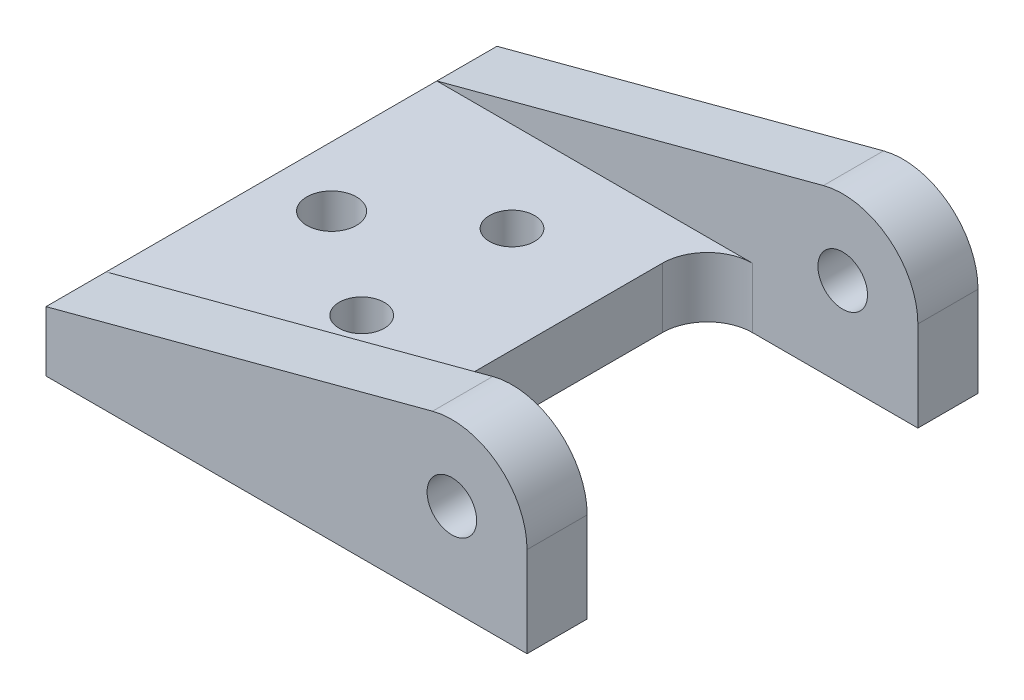
ISO-10303-21;
HEADER;
FILE_DESCRIPTION(('STEP AP214'),'2;1');
FILE_NAME('part.step','',(''),(''),'','','');
FILE_SCHEMA(('AUTOMOTIVE_DESIGN { 1 0 10303 214 1 1 1 1 }'));
ENDSEC;
DATA;
#1=APPLICATION_CONTEXT('core data for automotive mechanical design processes');
#2=APPLICATION_PROTOCOL_DEFINITION('international standard','automotive_design',2000,#1);
#3=PRODUCT_CONTEXT('',#1,'mechanical');
#4=PRODUCT('Part','Part','',(#3));
#5=PRODUCT_RELATED_PRODUCT_CATEGORY('part','',(#4));
#6=PRODUCT_DEFINITION_FORMATION('','',#4);
#7=PRODUCT_DEFINITION_CONTEXT('part definition',#1,'design');
#8=PRODUCT_DEFINITION('design','',#6,#7);
#9=PRODUCT_DEFINITION_SHAPE('','',#8);
#10=(LENGTH_UNIT() NAMED_UNIT(*) SI_UNIT(.MILLI.,.METRE.));
#11=(NAMED_UNIT(*) PLANE_ANGLE_UNIT() SI_UNIT($,.RADIAN.));
#12=(NAMED_UNIT(*) SI_UNIT($,.STERADIAN.) SOLID_ANGLE_UNIT());
#13=UNCERTAINTY_MEASURE_WITH_UNIT(LENGTH_MEASURE(1.E-05),#10,'distance_accuracy_value','');
#14=(GEOMETRIC_REPRESENTATION_CONTEXT(3) GLOBAL_UNCERTAINTY_ASSIGNED_CONTEXT((#13)) GLOBAL_UNIT_ASSIGNED_CONTEXT((#10,
#11,#12)) REPRESENTATION_CONTEXT('',''));
#15=CARTESIAN_POINT('',(0.,0.,0.));
#16=DIRECTION('',(0.,0.,1.));
#17=DIRECTION('',(1.,0.,0.));
#18=AXIS2_PLACEMENT_3D('',#15,#16,#17);
#19=CARTESIAN_POINT('',(25.7161218364079,10.8323552084932,30.));
#20=DIRECTION('',(0.256775632718418,-0.966471041698641,0.));
#21=DIRECTION('',(0.966471041698641,0.256775632718418,0.));
#22=AXIS2_PLACEMENT_3D('',#19,#20,#21);
#23=PLANE('',#22);
#24=DIRECTION('',(0.,0.,-1.));
#25=VECTOR('',#24,1.);
#26=CARTESIAN_POINT('',(0.,4.,30.));
#27=LINE('',#26,#25);
#28=CARTESIAN_POINT('',(0.,4.,4.));
#29=VERTEX_POINT('',#28);
#30=CARTESIAN_POINT('',(0.,4.,0.));
#31=VERTEX_POINT('',#30);
#32=EDGE_CURVE('E166',#29,#31,#27,.T.);
#33=ORIENTED_EDGE('',*,*,#32,.F.);
#34=DIRECTION('',(0.966471041698641,0.256775632718418,0.));
#35=VECTOR('',#34,1.);
#36=CARTESIAN_POINT('',(25.7161218364079,10.8323552084932,4.));
#37=LINE('',#36,#35);
#38=CARTESIAN_POINT('',(25.7161218364079,10.8323552084932,4.));
#39=VERTEX_POINT('',#38);
#40=EDGE_CURVE('E192',#29,#39,#37,.T.);
#41=ORIENTED_EDGE('',*,*,#40,.T.);
#42=DIRECTION('',(0.,0.,-1.));
#43=VECTOR('',#42,1.);
#44=CARTESIAN_POINT('',(25.7161218364079,10.8323552084932,30.));
#45=LINE('',#44,#43);
#46=CARTESIAN_POINT('',(25.7161218364079,10.8323552084932,0.));
#47=VERTEX_POINT('',#46);
#48=EDGE_CURVE('E165',#39,#47,#45,.T.);
#49=ORIENTED_EDGE('',*,*,#48,.T.);
#50=DIRECTION('',(-0.966471041698641,-0.256775632718418,0.));
#51=VECTOR('',#50,1.);
#52=CARTESIAN_POINT('',(25.7161218364079,10.8323552084932,0.));
#53=LINE('',#52,#51);
#54=EDGE_CURVE('E171',#47,#31,#53,.T.);
#55=ORIENTED_EDGE('',*,*,#54,.T.);
#56=EDGE_LOOP('',(#33,#41,#49,#55));
#57=FACE_BOUND('',#56,.T.);
#58=ADVANCED_FACE('F34',(#57),#23,.F.);
#59=CARTESIAN_POINT('',(32.,0.,30.));
#60=DIRECTION('',(-1.,0.,0.));
#61=DIRECTION('',(0.,0.,1.));
#62=AXIS2_PLACEMENT_3D('',#59,#60,#61);
#63=PLANE('',#62);
#64=DIRECTION('',(0.,0.,-1.));
#65=VECTOR('',#64,1.);
#66=CARTESIAN_POINT('',(32.,6.,30.));
#67=LINE('',#66,#65);
#68=CARTESIAN_POINT('',(32.,6.,4.));
#69=VERTEX_POINT('',#68);
#70=CARTESIAN_POINT('',(32.,6.,0.));
#71=VERTEX_POINT('',#70);
#72=EDGE_CURVE('E174',#69,#71,#67,.T.);
#73=ORIENTED_EDGE('',*,*,#72,.F.);
#74=DIRECTION('',(0.,-1.,0.));
#75=VECTOR('',#74,1.);
#76=CARTESIAN_POINT('',(32.,30.,4.));
#77=LINE('',#76,#75);
#78=CARTESIAN_POINT('',(32.,0.,4.));
#79=VERTEX_POINT('',#78);
#80=EDGE_CURVE('E188',#69,#79,#77,.T.);
#81=ORIENTED_EDGE('',*,*,#80,.T.);
#82=DIRECTION('',(0.,0.,-1.));
#83=VECTOR('',#82,1.);
#84=CARTESIAN_POINT('',(32.,0.,30.));
#85=LINE('',#84,#83);
#86=CARTESIAN_POINT('',(32.,0.,0.));
#87=VERTEX_POINT('',#86);
#88=EDGE_CURVE('E178',#79,#87,#85,.T.);
#89=ORIENTED_EDGE('',*,*,#88,.T.);
#90=DIRECTION('',(0.,1.,0.));
#91=VECTOR('',#90,1.);
#92=CARTESIAN_POINT('',(32.,0.,0.));
#93=LINE('',#92,#91);
#94=EDGE_CURVE('E257',#87,#71,#93,.T.);
#95=ORIENTED_EDGE('',*,*,#94,.T.);
#96=EDGE_LOOP('',(#73,#81,#89,#95));
#97=FACE_BOUND('',#96,.T.);
#98=ADVANCED_FACE('F287',(#97),#63,.F.);
#99=CARTESIAN_POINT('',(27.,6.,30.));
#100=DIRECTION('',(0.,0.,-1.));
#101=DIRECTION('',(-1.,0.,0.));
#102=AXIS2_PLACEMENT_3D('',#99,#100,#101);
#103=CYLINDRICAL_SURFACE('',#102,5.);
#104=ORIENTED_EDGE('',*,*,#48,.F.);
#105=CARTESIAN_POINT('',(27.,6.,4.));
#106=DIRECTION('',(0.,0.,-1.));
#107=DIRECTION('',(-1.,0.,0.));
#108=AXIS2_PLACEMENT_3D('',#105,#106,#107);
#109=CIRCLE('',#108,5.);
#110=EDGE_CURVE('E235',#39,#69,#109,.T.);
#111=ORIENTED_EDGE('',*,*,#110,.T.);
#112=ORIENTED_EDGE('',*,*,#72,.T.);
#113=CARTESIAN_POINT('',(27.,6.,0.));
#114=DIRECTION('',(0.,0.,1.));
#115=DIRECTION('',(1.,0.,0.));
#116=AXIS2_PLACEMENT_3D('',#113,#114,#115);
#117=CIRCLE('',#116,5.);
#118=EDGE_CURVE('E259',#71,#47,#117,.T.);
#119=ORIENTED_EDGE('',*,*,#118,.T.);
#120=EDGE_LOOP('',(#104,#111,#112,#119));
#121=FACE_BOUND('',#120,.T.);
#122=ADVANCED_FACE('F293',(#121),#103,.T.);
#123=CARTESIAN_POINT('',(27.,6.,30.));
#124=DIRECTION('',(0.,0.,-1.));
#125=DIRECTION('',(-1.,0.,0.));
#126=AXIS2_PLACEMENT_3D('',#123,#124,#125);
#127=CYLINDRICAL_SURFACE('',#126,1.65);
#128=CARTESIAN_POINT('',(27.,6.,4.));
#129=DIRECTION('',(0.,0.,-1.));
#130=DIRECTION('',(-1.,0.,0.));
#131=AXIS2_PLACEMENT_3D('',#128,#129,#130);
#132=CIRCLE('',#131,1.65);
#133=CARTESIAN_POINT('',(25.35,6.,4.));
#134=VERTEX_POINT('',#133);
#135=EDGE_CURVE('E189',#134,#134,#132,.T.);
#136=ORIENTED_EDGE('',*,*,#135,.F.);
#137=EDGE_LOOP('',(#136));
#138=FACE_BOUND('',#137,.T.);
#139=CARTESIAN_POINT('',(27.,6.,0.));
#140=DIRECTION('',(0.,0.,1.));
#141=DIRECTION('',(1.,0.,0.));
#142=AXIS2_PLACEMENT_3D('',#139,#140,#141);
#143=CIRCLE('',#142,1.65);
#144=CARTESIAN_POINT('',(28.65,6.,0.));
#145=VERTEX_POINT('',#144);
#146=EDGE_CURVE('E238',#145,#145,#143,.T.);
#147=ORIENTED_EDGE('',*,*,#146,.F.);
#148=EDGE_LOOP('',(#147));
#149=FACE_BOUND('',#148,.T.);
#150=ADVANCED_FACE('F310',(#138,#149),#127,.F.);
#151=CARTESIAN_POINT('',(27.,6.,30.));
#152=DIRECTION('',(0.,0.,1.));
#153=DIRECTION('',(1.,0.,0.));
#154=AXIS2_PLACEMENT_3D('',#151,#152,#153);
#155=PLANE('',#154);
#156=DIRECTION('',(0.,-1.,0.));
#157=VECTOR('',#156,1.);
#158=CARTESIAN_POINT('',(0.,4.,30.));
#159=LINE('',#158,#157);
#160=CARTESIAN_POINT('',(0.,4.,30.));
#161=VERTEX_POINT('',#160);
#162=CARTESIAN_POINT('',(0.,0.,30.));
#163=VERTEX_POINT('',#162);
#164=EDGE_CURVE('E164',#161,#163,#159,.T.);
#165=ORIENTED_EDGE('',*,*,#164,.T.);
#166=DIRECTION('',(1.,0.,0.));
#167=VECTOR('',#166,1.);
#168=CARTESIAN_POINT('',(0.,0.,30.));
#169=LINE('',#168,#167);
#170=CARTESIAN_POINT('',(32.,0.,30.));
#171=VERTEX_POINT('',#170);
#172=EDGE_CURVE('E246',#163,#171,#169,.T.);
#173=ORIENTED_EDGE('',*,*,#172,.T.);
#174=DIRECTION('',(0.,1.,0.));
#175=VECTOR('',#174,1.);
#176=CARTESIAN_POINT('',(32.,0.,30.));
#177=LINE('',#176,#175);
#178=CARTESIAN_POINT('',(32.,6.,30.));
#179=VERTEX_POINT('',#178);
#180=EDGE_CURVE('E248',#171,#179,#177,.T.);
#181=ORIENTED_EDGE('',*,*,#180,.T.);
#182=CARTESIAN_POINT('',(27.,6.,30.));
#183=DIRECTION('',(0.,0.,1.));
#184=DIRECTION('',(1.,0.,0.));
#185=AXIS2_PLACEMENT_3D('',#182,#183,#184);
#186=CIRCLE('',#185,5.);
#187=CARTESIAN_POINT('',(25.7161218364079,10.8323552084932,30.));
#188=VERTEX_POINT('',#187);
#189=EDGE_CURVE('E250',#179,#188,#186,.T.);
#190=ORIENTED_EDGE('',*,*,#189,.T.);
#191=DIRECTION('',(-0.966471041698641,-0.256775632718418,0.));
#192=VECTOR('',#191,1.);
#193=CARTESIAN_POINT('',(25.7161218364079,10.8323552084932,30.));
#194=LINE('',#193,#192);
#195=EDGE_CURVE('E169',#188,#161,#194,.T.);
#196=ORIENTED_EDGE('',*,*,#195,.T.);
#197=EDGE_LOOP('',(#165,#173,#181,#190,#196));
#198=FACE_BOUND('',#197,.T.);
#199=CARTESIAN_POINT('',(27.,6.,30.));
#200=DIRECTION('',(0.,0.,1.));
#201=DIRECTION('',(1.,0.,0.));
#202=AXIS2_PLACEMENT_3D('',#199,#200,#201);
#203=CIRCLE('',#202,1.65);
#204=CARTESIAN_POINT('',(28.65,6.,30.));
#205=VERTEX_POINT('',#204);
#206=EDGE_CURVE('E239',#205,#205,#203,.T.);
#207=ORIENTED_EDGE('',*,*,#206,.F.);
#208=EDGE_LOOP('',(#207));
#209=FACE_BOUND('',#208,.T.);
#210=ADVANCED_FACE('F276',(#198,#209),#155,.T.);
#211=CARTESIAN_POINT('',(27.,6.,0.));
#212=DIRECTION('',(0.,0.,1.));
#213=DIRECTION('',(1.,0.,0.));
#214=AXIS2_PLACEMENT_3D('',#211,#212,#213);
#215=PLANE('',#214);
#216=DIRECTION('',(0.,-1.,0.));
#217=VECTOR('',#216,1.);
#218=CARTESIAN_POINT('',(0.,4.,0.));
#219=LINE('',#218,#217);
#220=CARTESIAN_POINT('',(0.,0.,0.));
#221=VERTEX_POINT('',#220);
#222=EDGE_CURVE('E242',#31,#221,#219,.T.);
#223=ORIENTED_EDGE('',*,*,#222,.F.);
#224=ORIENTED_EDGE('',*,*,#54,.F.);
#225=ORIENTED_EDGE('',*,*,#118,.F.);
#226=ORIENTED_EDGE('',*,*,#94,.F.);
#227=DIRECTION('',(1.,0.,0.));
#228=VECTOR('',#227,1.);
#229=CARTESIAN_POINT('',(0.,0.,0.));
#230=LINE('',#229,#228);
#231=EDGE_CURVE('E254',#221,#87,#230,.T.);
#232=ORIENTED_EDGE('',*,*,#231,.F.);
#233=EDGE_LOOP('',(#223,#224,#225,#226,#232));
#234=FACE_BOUND('',#233,.T.);
#235=ORIENTED_EDGE('',*,*,#146,.T.);
#236=EDGE_LOOP('',(#235));
#237=FACE_BOUND('',#236,.T.);
#238=ADVANCED_FACE('F269',(#234,#237),#215,.F.);
#239=CARTESIAN_POINT('',(0.,4.,30.));
#240=DIRECTION('',(1.,0.,0.));
#241=DIRECTION('',(0.,1.,0.));
#242=AXIS2_PLACEMENT_3D('',#239,#240,#241);
#243=PLANE('',#242);
#244=ORIENTED_EDGE('',*,*,#222,.T.);
#245=DIRECTION('',(0.,0.,-1.));
#246=VECTOR('',#245,1.);
#247=CARTESIAN_POINT('',(0.,0.,30.));
#248=LINE('',#247,#246);
#249=EDGE_CURVE('E182',#163,#221,#248,.T.);
#250=ORIENTED_EDGE('',*,*,#249,.F.);
#251=ORIENTED_EDGE('',*,*,#164,.F.);
#252=CARTESIAN_POINT('',(0.,4.,26.));
#253=VERTEX_POINT('',#252);
#254=EDGE_CURVE('E133',#161,#253,#27,.T.);
#255=ORIENTED_EDGE('',*,*,#254,.T.);
#256=DIRECTION('',(0.,0.,-1.));
#257=VECTOR('',#256,1.);
#258=CARTESIAN_POINT('',(0.,4.,4.));
#259=LINE('',#258,#257);
#260=EDGE_CURVE('E145',#253,#29,#259,.T.);
#261=ORIENTED_EDGE('',*,*,#260,.T.);
#262=ORIENTED_EDGE('',*,*,#32,.T.);
#263=EDGE_LOOP('',(#244,#250,#251,#255,#261,#262));
#264=FACE_BOUND('',#263,.T.);
#265=ADVANCED_FACE('F161',(#264),#243,.F.);
#266=CARTESIAN_POINT('',(0.,0.,30.));
#267=DIRECTION('',(0.,1.,0.));
#268=DIRECTION('',(0.,0.,1.));
#269=AXIS2_PLACEMENT_3D('',#266,#267,#268);
#270=PLANE('',#269);
#271=CARTESIAN_POINT('',(11.,0.,10.));
#272=DIRECTION('',(0.,1.,0.));
#273=DIRECTION('',(0.,0.,1.));
#274=AXIS2_PLACEMENT_3D('',#271,#272,#273);
#275=CIRCLE('',#274,1.5);
#276=CARTESIAN_POINT('',(11.,0.,11.5));
#277=VERTEX_POINT('',#276);
#278=EDGE_CURVE('E422',#277,#277,#275,.T.);
#279=ORIENTED_EDGE('',*,*,#278,.T.);
#280=EDGE_LOOP('',(#279));
#281=FACE_BOUND('',#280,.T.);
#282=CARTESIAN_POINT('',(11.,0.,20.));
#283=DIRECTION('',(0.,1.,0.));
#284=DIRECTION('',(0.,0.,1.));
#285=AXIS2_PLACEMENT_3D('',#282,#283,#284);
#286=CIRCLE('',#285,1.5);
#287=CARTESIAN_POINT('',(11.,0.,21.5));
#288=VERTEX_POINT('',#287);
#289=EDGE_CURVE('E425',#288,#288,#286,.T.);
#290=ORIENTED_EDGE('',*,*,#289,.T.);
#291=EDGE_LOOP('',(#290));
#292=FACE_BOUND('',#291,.T.);
#293=CARTESIAN_POINT('',(4.,0.,15.));
#294=DIRECTION('',(0.,1.,0.));
#295=DIRECTION('',(0.,0.,1.));
#296=AXIS2_PLACEMENT_3D('',#293,#294,#295);
#297=CIRCLE('',#296,1.65);
#298=CARTESIAN_POINT('',(4.,0.,16.65));
#299=VERTEX_POINT('',#298);
#300=EDGE_CURVE('E218',#299,#299,#297,.T.);
#301=ORIENTED_EDGE('',*,*,#300,.T.);
#302=EDGE_LOOP('',(#301));
#303=FACE_BOUND('',#302,.T.);
#304=ORIENTED_EDGE('',*,*,#88,.F.);
#305=DIRECTION('',(1.,0.,0.));
#306=VECTOR('',#305,1.);
#307=CARTESIAN_POINT('',(32.,0.,4.));
#308=LINE('',#307,#306);
#309=CARTESIAN_POINT('',(21.,0.,4.));
#310=VERTEX_POINT('',#309);
#311=EDGE_CURVE('E210',#310,#79,#308,.T.);
#312=ORIENTED_EDGE('',*,*,#311,.F.);
#313=CARTESIAN_POINT('',(21.,0.,7.));
#314=DIRECTION('',(0.,1.,0.));
#315=DIRECTION('',(0.,0.,1.));
#316=AXIS2_PLACEMENT_3D('',#313,#314,#315);
#317=CIRCLE('',#316,3.);
#318=CARTESIAN_POINT('',(18.,0.,7.));
#319=VERTEX_POINT('',#318);
#320=EDGE_CURVE('E42',#310,#319,#317,.T.);
#321=ORIENTED_EDGE('',*,*,#320,.T.);
#322=DIRECTION('',(0.,0.,-1.));
#323=VECTOR('',#322,1.);
#324=CARTESIAN_POINT('',(18.,0.,4.));
#325=LINE('',#324,#323);
#326=CARTESIAN_POINT('',(18.,0.,23.));
#327=VERTEX_POINT('',#326);
#328=EDGE_CURVE('E209',#327,#319,#325,.T.);
#329=ORIENTED_EDGE('',*,*,#328,.F.);
#330=CARTESIAN_POINT('',(21.,0.,23.));
#331=DIRECTION('',(0.,1.,0.));
#332=DIRECTION('',(0.,0.,1.));
#333=AXIS2_PLACEMENT_3D('',#330,#331,#332);
#334=CIRCLE('',#333,3.);
#335=CARTESIAN_POINT('',(21.,0.,26.));
#336=VERTEX_POINT('',#335);
#337=EDGE_CURVE('E200',#327,#336,#334,.T.);
#338=ORIENTED_EDGE('',*,*,#337,.T.);
#339=DIRECTION('',(-1.,0.,0.));
#340=VECTOR('',#339,1.);
#341=CARTESIAN_POINT('',(32.,0.,26.));
#342=LINE('',#341,#340);
#343=CARTESIAN_POINT('',(32.,0.,26.));
#344=VERTEX_POINT('',#343);
#345=EDGE_CURVE('E215',#344,#336,#342,.T.);
#346=ORIENTED_EDGE('',*,*,#345,.F.);
#347=EDGE_CURVE('E179',#171,#344,#85,.T.);
#348=ORIENTED_EDGE('',*,*,#347,.F.);
#349=ORIENTED_EDGE('',*,*,#172,.F.);
#350=ORIENTED_EDGE('',*,*,#249,.T.);
#351=ORIENTED_EDGE('',*,*,#231,.T.);
#352=EDGE_LOOP('',(#304,#312,#321,#329,#338,#346,#348,#349,#350,#351));
#353=FACE_BOUND('',#352,.T.);
#354=ADVANCED_FACE('F208',(#281,#292,#303,#353),#270,.F.);
#355=ORIENTED_EDGE('',*,*,#347,.T.);
#356=DIRECTION('',(0.,-1.,0.));
#357=VECTOR('',#356,1.);
#358=CARTESIAN_POINT('',(32.,30.,26.));
#359=LINE('',#358,#357);
#360=CARTESIAN_POINT('',(32.,6.,26.));
#361=VERTEX_POINT('',#360);
#362=EDGE_CURVE('E228',#361,#344,#359,.T.);
#363=ORIENTED_EDGE('',*,*,#362,.F.);
#364=EDGE_CURVE('E175',#179,#361,#67,.T.);
#365=ORIENTED_EDGE('',*,*,#364,.F.);
#366=ORIENTED_EDGE('',*,*,#180,.F.);
#367=EDGE_LOOP('',(#355,#363,#365,#366));
#368=FACE_BOUND('',#367,.T.);
#369=ADVANCED_FACE('F284',(#368),#63,.F.);
#370=ORIENTED_EDGE('',*,*,#364,.T.);
#371=CARTESIAN_POINT('',(27.,6.,26.));
#372=DIRECTION('',(0.,0.,1.));
#373=DIRECTION('',(1.,0.,0.));
#374=AXIS2_PLACEMENT_3D('',#371,#372,#373);
#375=CIRCLE('',#374,5.);
#376=CARTESIAN_POINT('',(25.7161218364079,10.8323552084932,26.));
#377=VERTEX_POINT('',#376);
#378=EDGE_CURVE('E140',#361,#377,#375,.T.);
#379=ORIENTED_EDGE('',*,*,#378,.T.);
#380=EDGE_CURVE('E136',#188,#377,#45,.T.);
#381=ORIENTED_EDGE('',*,*,#380,.F.);
#382=ORIENTED_EDGE('',*,*,#189,.F.);
#383=EDGE_LOOP('',(#370,#379,#381,#382));
#384=FACE_BOUND('',#383,.T.);
#385=ADVANCED_FACE('F281',(#384),#103,.T.);
#386=DIRECTION('',(-0.966471041698641,-0.256775632718418,0.));
#387=VECTOR('',#386,1.);
#388=CARTESIAN_POINT('',(25.7161218364079,10.8323552084932,26.));
#389=LINE('',#388,#387);
#390=EDGE_CURVE('E128',#377,#253,#389,.T.);
#391=ORIENTED_EDGE('',*,*,#390,.T.);
#392=ORIENTED_EDGE('',*,*,#254,.F.);
#393=ORIENTED_EDGE('',*,*,#195,.F.);
#394=ORIENTED_EDGE('',*,*,#380,.T.);
#395=EDGE_LOOP('',(#391,#392,#393,#394));
#396=FACE_BOUND('',#395,.T.);
#397=ADVANCED_FACE('F130',(#396),#23,.F.);
#398=CARTESIAN_POINT('',(27.,6.,26.));
#399=DIRECTION('',(0.,0.,1.));
#400=DIRECTION('',(1.,0.,0.));
#401=AXIS2_PLACEMENT_3D('',#398,#399,#400);
#402=CIRCLE('',#401,1.65);
#403=CARTESIAN_POINT('',(28.65,6.,26.));
#404=VERTEX_POINT('',#403);
#405=EDGE_CURVE('E141',#404,#404,#402,.T.);
#406=ORIENTED_EDGE('',*,*,#405,.F.);
#407=EDGE_LOOP('',(#406));
#408=FACE_BOUND('',#407,.T.);
#409=ORIENTED_EDGE('',*,*,#206,.T.);
#410=EDGE_LOOP('',(#409));
#411=FACE_BOUND('',#410,.T.);
#412=ADVANCED_FACE('F304',(#408,#411),#127,.F.);
#413=CARTESIAN_POINT('',(18.,30.,4.));
#414=DIRECTION('',(-1.,0.,0.));
#415=DIRECTION('',(0.,0.,1.));
#416=AXIS2_PLACEMENT_3D('',#413,#414,#415);
#417=PLANE('',#416);
#418=DIRECTION('',(0.,0.,1.));
#419=VECTOR('',#418,1.);
#420=CARTESIAN_POINT('',(18.,4.,4.));
#421=LINE('',#420,#419);
#422=CARTESIAN_POINT('',(18.,4.,7.));
#423=VERTEX_POINT('',#422);
#424=CARTESIAN_POINT('',(18.,4.,23.));
#425=VERTEX_POINT('',#424);
#426=EDGE_CURVE('E158',#423,#425,#421,.T.);
#427=ORIENTED_EDGE('',*,*,#426,.T.);
#428=DIRECTION('',(0.,-1.,0.));
#429=VECTOR('',#428,1.);
#430=CARTESIAN_POINT('',(18.,0.,23.));
#431=LINE('',#430,#429);
#432=EDGE_CURVE('E194',#425,#327,#431,.T.);
#433=ORIENTED_EDGE('',*,*,#432,.T.);
#434=ORIENTED_EDGE('',*,*,#328,.T.);
#435=DIRECTION('',(0.,-1.,0.));
#436=VECTOR('',#435,1.);
#437=CARTESIAN_POINT('',(18.,4.,7.));
#438=LINE('',#437,#436);
#439=EDGE_CURVE('E185',#319,#423,#438,.F.);
#440=ORIENTED_EDGE('',*,*,#439,.T.);
#441=EDGE_LOOP('',(#427,#433,#434,#440));
#442=FACE_BOUND('',#441,.T.);
#443=ADVANCED_FACE('F213',(#442),#417,.F.);
#444=CARTESIAN_POINT('',(32.,30.,4.));
#445=DIRECTION('',(0.,0.,-1.));
#446=DIRECTION('',(-1.,0.,0.));
#447=AXIS2_PLACEMENT_3D('',#444,#445,#446);
#448=PLANE('',#447);
#449=ORIENTED_EDGE('',*,*,#135,.T.);
#450=EDGE_LOOP('',(#449));
#451=FACE_BOUND('',#450,.T.);
#452=DIRECTION('',(1.,0.,0.));
#453=VECTOR('',#452,1.);
#454=CARTESIAN_POINT('',(18.,4.,4.));
#455=LINE('',#454,#453);
#456=CARTESIAN_POINT('',(21.,4.,4.));
#457=VERTEX_POINT('',#456);
#458=EDGE_CURVE('E49',#29,#457,#455,.T.);
#459=ORIENTED_EDGE('',*,*,#458,.T.);
#460=DIRECTION('',(0.,-1.,0.));
#461=VECTOR('',#460,1.);
#462=CARTESIAN_POINT('',(21.,0.,4.));
#463=LINE('',#462,#461);
#464=EDGE_CURVE('E198',#457,#310,#463,.T.);
#465=ORIENTED_EDGE('',*,*,#464,.T.);
#466=ORIENTED_EDGE('',*,*,#311,.T.);
#467=ORIENTED_EDGE('',*,*,#80,.F.);
#468=ORIENTED_EDGE('',*,*,#110,.F.);
#469=ORIENTED_EDGE('',*,*,#40,.F.);
#470=EDGE_LOOP('',(#459,#465,#466,#467,#468,#469));
#471=FACE_BOUND('',#470,.T.);
#472=ADVANCED_FACE('F314',(#451,#471),#448,.F.);
#473=CARTESIAN_POINT('',(32.,30.,26.));
#474=DIRECTION('',(0.,0.,1.));
#475=DIRECTION('',(1.,0.,0.));
#476=AXIS2_PLACEMENT_3D('',#473,#474,#475);
#477=PLANE('',#476);
#478=ORIENTED_EDGE('',*,*,#405,.T.);
#479=EDGE_LOOP('',(#478));
#480=FACE_BOUND('',#479,.T.);
#481=ORIENTED_EDGE('',*,*,#345,.T.);
#482=DIRECTION('',(0.,-1.,0.));
#483=VECTOR('',#482,1.);
#484=CARTESIAN_POINT('',(21.,4.,26.));
#485=LINE('',#484,#483);
#486=CARTESIAN_POINT('',(21.,4.,26.));
#487=VERTEX_POINT('',#486);
#488=EDGE_CURVE('E156',#336,#487,#485,.F.);
#489=ORIENTED_EDGE('',*,*,#488,.T.);
#490=DIRECTION('',(-1.,0.,0.));
#491=VECTOR('',#490,1.);
#492=CARTESIAN_POINT('',(18.,4.,26.));
#493=LINE('',#492,#491);
#494=EDGE_CURVE('E148',#487,#253,#493,.T.);
#495=ORIENTED_EDGE('',*,*,#494,.T.);
#496=ORIENTED_EDGE('',*,*,#390,.F.);
#497=ORIENTED_EDGE('',*,*,#378,.F.);
#498=ORIENTED_EDGE('',*,*,#362,.T.);
#499=EDGE_LOOP('',(#481,#489,#495,#496,#497,#498));
#500=FACE_BOUND('',#499,.T.);
#501=ADVANCED_FACE('F154',(#480,#500),#477,.F.);
#502=CARTESIAN_POINT('',(0.,4.,0.));
#503=DIRECTION('',(0.,-1.,0.));
#504=DIRECTION('',(0.,0.,-1.));
#505=AXIS2_PLACEMENT_3D('',#502,#503,#504);
#506=PLANE('',#505);
#507=CARTESIAN_POINT('',(11.,4.,10.));
#508=DIRECTION('',(0.,1.,0.));
#509=DIRECTION('',(0.,0.,1.));
#510=AXIS2_PLACEMENT_3D('',#507,#508,#509);
#511=CIRCLE('',#510,1.5);
#512=CARTESIAN_POINT('',(11.,4.,11.5));
#513=VERTEX_POINT('',#512);
#514=EDGE_CURVE('E424',#513,#513,#511,.T.);
#515=ORIENTED_EDGE('',*,*,#514,.F.);
#516=EDGE_LOOP('',(#515));
#517=FACE_BOUND('',#516,.T.);
#518=CARTESIAN_POINT('',(11.,4.,20.));
#519=DIRECTION('',(0.,1.,0.));
#520=DIRECTION('',(0.,0.,1.));
#521=AXIS2_PLACEMENT_3D('',#518,#519,#520);
#522=CIRCLE('',#521,1.5);
#523=CARTESIAN_POINT('',(11.,4.,21.5));
#524=VERTEX_POINT('',#523);
#525=EDGE_CURVE('E429',#524,#524,#522,.T.);
#526=ORIENTED_EDGE('',*,*,#525,.F.);
#527=EDGE_LOOP('',(#526));
#528=FACE_BOUND('',#527,.T.);
#529=CARTESIAN_POINT('',(4.,4.,15.));
#530=DIRECTION('',(0.,1.,0.));
#531=DIRECTION('',(0.,0.,1.));
#532=AXIS2_PLACEMENT_3D('',#529,#530,#531);
#533=CIRCLE('',#532,1.65);
#534=CARTESIAN_POINT('',(4.,4.,16.65));
#535=VERTEX_POINT('',#534);
#536=EDGE_CURVE('E221',#535,#535,#533,.T.);
#537=ORIENTED_EDGE('',*,*,#536,.F.);
#538=EDGE_LOOP('',(#537));
#539=FACE_BOUND('',#538,.T.);
#540=ORIENTED_EDGE('',*,*,#426,.F.);
#541=CARTESIAN_POINT('',(21.,4.,7.));
#542=DIRECTION('',(0.,-1.,0.));
#543=DIRECTION('',(0.,0.,-1.));
#544=AXIS2_PLACEMENT_3D('',#541,#542,#543);
#545=CIRCLE('',#544,3.);
#546=EDGE_CURVE('E11',#423,#457,#545,.T.);
#547=ORIENTED_EDGE('',*,*,#546,.T.);
#548=ORIENTED_EDGE('',*,*,#458,.F.);
#549=ORIENTED_EDGE('',*,*,#260,.F.);
#550=ORIENTED_EDGE('',*,*,#494,.F.);
#551=CARTESIAN_POINT('',(21.,4.,23.));
#552=DIRECTION('',(0.,-1.,0.));
#553=DIRECTION('',(0.,0.,-1.));
#554=AXIS2_PLACEMENT_3D('',#551,#552,#553);
#555=CIRCLE('',#554,3.);
#556=EDGE_CURVE('E202',#487,#425,#555,.T.);
#557=ORIENTED_EDGE('',*,*,#556,.T.);
#558=EDGE_LOOP('',(#540,#547,#548,#549,#550,#557));
#559=FACE_BOUND('',#558,.T.);
#560=ADVANCED_FACE('F147',(#517,#528,#539,#559),#506,.F.);
#561=CARTESIAN_POINT('',(21.,30.,23.));
#562=DIRECTION('',(0.,1.,0.));
#563=DIRECTION('',(0.,0.,1.));
#564=AXIS2_PLACEMENT_3D('',#561,#562,#563);
#565=CYLINDRICAL_SURFACE('',#564,3.);
#566=ORIENTED_EDGE('',*,*,#556,.F.);
#567=ORIENTED_EDGE('',*,*,#488,.F.);
#568=ORIENTED_EDGE('',*,*,#337,.F.);
#569=ORIENTED_EDGE('',*,*,#432,.F.);
#570=EDGE_LOOP('',(#566,#567,#568,#569));
#571=FACE_BOUND('',#570,.T.);
#572=ADVANCED_FACE('F336',(#571),#565,.F.);
#573=CARTESIAN_POINT('',(21.,30.,7.));
#574=DIRECTION('',(0.,1.,0.));
#575=DIRECTION('',(0.,0.,1.));
#576=AXIS2_PLACEMENT_3D('',#573,#574,#575);
#577=CYLINDRICAL_SURFACE('',#576,3.);
#578=ORIENTED_EDGE('',*,*,#546,.F.);
#579=ORIENTED_EDGE('',*,*,#439,.F.);
#580=ORIENTED_EDGE('',*,*,#320,.F.);
#581=ORIENTED_EDGE('',*,*,#464,.F.);
#582=EDGE_LOOP('',(#578,#579,#580,#581));
#583=FACE_BOUND('',#582,.T.);
#584=ADVANCED_FACE('F36',(#583),#577,.F.);
#585=CARTESIAN_POINT('',(4.,-26.,15.));
#586=DIRECTION('',(0.,1.,0.));
#587=DIRECTION('',(0.,0.,1.));
#588=AXIS2_PLACEMENT_3D('',#585,#586,#587);
#589=CYLINDRICAL_SURFACE('',#588,1.65);
#590=ORIENTED_EDGE('',*,*,#536,.T.);
#591=EDGE_LOOP('',(#590));
#592=FACE_BOUND('',#591,.T.);
#593=ORIENTED_EDGE('',*,*,#300,.F.);
#594=EDGE_LOOP('',(#593));
#595=FACE_BOUND('',#594,.T.);
#596=ADVANCED_FACE('F343',(#592,#595),#589,.F.);
#597=CARTESIAN_POINT('',(11.,0.,20.));
#598=DIRECTION('',(0.,1.,0.));
#599=DIRECTION('',(0.,0.,1.));
#600=AXIS2_PLACEMENT_3D('',#597,#598,#599);
#601=CYLINDRICAL_SURFACE('',#600,1.5);
#602=ORIENTED_EDGE('',*,*,#289,.F.);
#603=EDGE_LOOP('',(#602));
#604=FACE_BOUND('',#603,.T.);
#605=ORIENTED_EDGE('',*,*,#525,.T.);
#606=EDGE_LOOP('',(#605));
#607=FACE_BOUND('',#606,.T.);
#608=ADVANCED_FACE('F386',(#604,#607),#601,.F.);
#609=CARTESIAN_POINT('',(11.,0.,10.));
#610=DIRECTION('',(0.,1.,0.));
#611=DIRECTION('',(0.,0.,1.));
#612=AXIS2_PLACEMENT_3D('',#609,#610,#611);
#613=CYLINDRICAL_SURFACE('',#612,1.5);
#614=ORIENTED_EDGE('',*,*,#278,.F.);
#615=EDGE_LOOP('',(#614));
#616=FACE_BOUND('',#615,.T.);
#617=ORIENTED_EDGE('',*,*,#514,.T.);
#618=EDGE_LOOP('',(#617));
#619=FACE_BOUND('',#618,.T.);
#620=ADVANCED_FACE('F406',(#616,#619),#613,.F.);
#621=CLOSED_SHELL('',(#58,#98,#122,#150,#210,#238,#265,#354,#369,#385,#397,#412,#443,#472,#501,
#560,#572,#584,#596,#608,#620));
#622=MANIFOLD_SOLID_BREP('B2',#621);
#623=ADVANCED_BREP_SHAPE_REPRESENTATION('',(#18,#622),#14);
#624=SHAPE_DEFINITION_REPRESENTATION(#9,#623);
ENDSEC;
END-ISO-10303-21;
